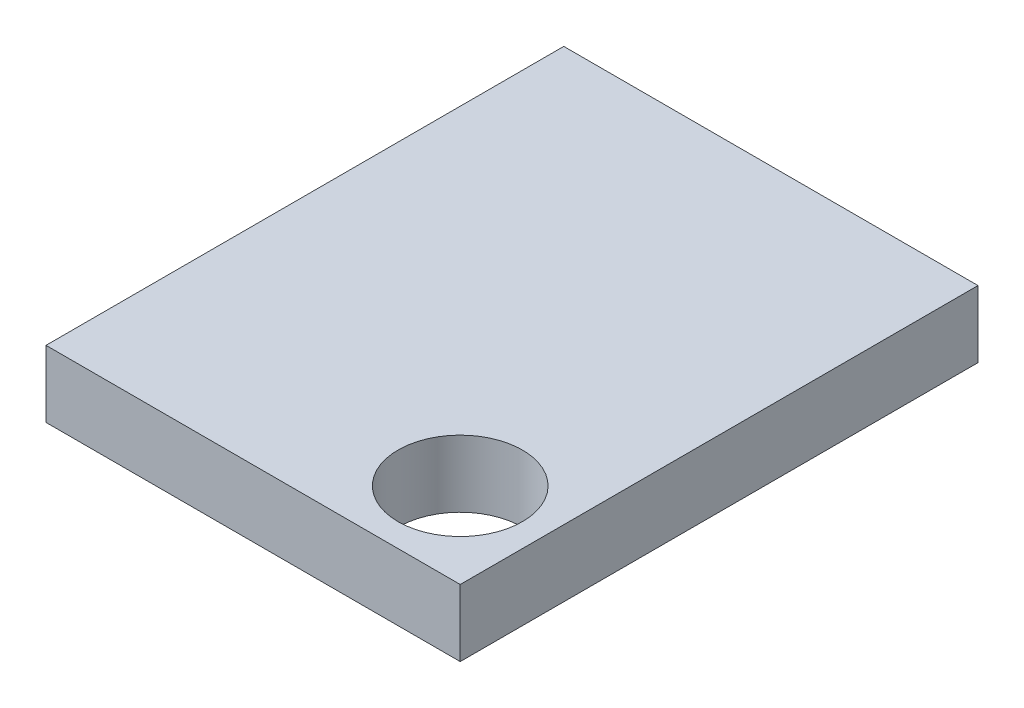
ISO-10303-21;
HEADER;
FILE_DESCRIPTION(('STEP AP214'),'2;1');
FILE_NAME('part.step','',(''),(''),'','','');
FILE_SCHEMA(('AUTOMOTIVE_DESIGN { 1 0 10303 214 1 1 1 1 }'));
ENDSEC;
DATA;
#1=APPLICATION_CONTEXT('core data for automotive mechanical design processes');
#2=APPLICATION_PROTOCOL_DEFINITION('international standard','automotive_design',2000,#1);
#3=PRODUCT_CONTEXT('',#1,'mechanical');
#4=PRODUCT('Part','Part','',(#3));
#5=PRODUCT_RELATED_PRODUCT_CATEGORY('part','',(#4));
#6=PRODUCT_DEFINITION_FORMATION('','',#4);
#7=PRODUCT_DEFINITION_CONTEXT('part definition',#1,'design');
#8=PRODUCT_DEFINITION('design','',#6,#7);
#9=PRODUCT_DEFINITION_SHAPE('','',#8);
#10=(LENGTH_UNIT() NAMED_UNIT(*) SI_UNIT(.MILLI.,.METRE.));
#11=(NAMED_UNIT(*) PLANE_ANGLE_UNIT() SI_UNIT($,.RADIAN.));
#12=(NAMED_UNIT(*) SI_UNIT($,.STERADIAN.) SOLID_ANGLE_UNIT());
#13=UNCERTAINTY_MEASURE_WITH_UNIT(LENGTH_MEASURE(1.E-05),#10,'distance_accuracy_value','');
#14=(GEOMETRIC_REPRESENTATION_CONTEXT(3) GLOBAL_UNCERTAINTY_ASSIGNED_CONTEXT((#13)) GLOBAL_UNIT_ASSIGNED_CONTEXT((#10,
#11,#12)) REPRESENTATION_CONTEXT('',''));
#15=CARTESIAN_POINT('',(0.,0.,0.));
#16=DIRECTION('',(0.,0.,1.));
#17=DIRECTION('',(1.,0.,0.));
#18=AXIS2_PLACEMENT_3D('',#15,#16,#17);
#19=CARTESIAN_POINT('',(5.08,1.6383,6.35));
#20=DIRECTION('',(-1.,0.,0.));
#21=DIRECTION('',(0.,0.,1.));
#22=AXIS2_PLACEMENT_3D('',#19,#20,#21);
#23=PLANE('',#22);
#24=DIRECTION('',(0.,0.,-1.));
#25=VECTOR('',#24,1.);
#26=CARTESIAN_POINT('',(5.08,0.,6.35));
#27=LINE('',#26,#25);
#28=CARTESIAN_POINT('',(5.08,0.,6.35));
#29=VERTEX_POINT('',#28);
#30=CARTESIAN_POINT('',(5.08,0.,-6.35));
#31=VERTEX_POINT('',#30);
#32=EDGE_CURVE('E98',#29,#31,#27,.T.);
#33=ORIENTED_EDGE('',*,*,#32,.T.);
#34=DIRECTION('',(0.,-1.,0.));
#35=VECTOR('',#34,1.);
#36=CARTESIAN_POINT('',(5.08,1.6383,-6.35));
#37=LINE('',#36,#35);
#38=CARTESIAN_POINT('',(5.08,1.6383,-6.35));
#39=VERTEX_POINT('',#38);
#40=EDGE_CURVE('E11',#39,#31,#37,.T.);
#41=ORIENTED_EDGE('',*,*,#40,.F.);
#42=DIRECTION('',(0.,0.,-1.));
#43=VECTOR('',#42,1.);
#44=CARTESIAN_POINT('',(5.08,1.6383,6.35));
#45=LINE('',#44,#43);
#46=CARTESIAN_POINT('',(5.08,1.6383,6.35));
#47=VERTEX_POINT('',#46);
#48=EDGE_CURVE('E86',#47,#39,#45,.T.);
#49=ORIENTED_EDGE('',*,*,#48,.F.);
#50=DIRECTION('',(0.,-1.,0.));
#51=VECTOR('',#50,1.);
#52=CARTESIAN_POINT('',(5.08,1.6383,6.35));
#53=LINE('',#52,#51);
#54=EDGE_CURVE('E94',#47,#29,#53,.T.);
#55=ORIENTED_EDGE('',*,*,#54,.T.);
#56=EDGE_LOOP('',(#33,#41,#49,#55));
#57=FACE_BOUND('',#56,.T.);
#58=ADVANCED_FACE('F35',(#57),#23,.F.);
#59=CARTESIAN_POINT('',(-5.08,1.6383,-6.35));
#60=DIRECTION('',(0.,0.,1.));
#61=DIRECTION('',(1.,0.,0.));
#62=AXIS2_PLACEMENT_3D('',#59,#60,#61);
#63=PLANE('',#62);
#64=DIRECTION('',(-1.,0.,0.));
#65=VECTOR('',#64,1.);
#66=CARTESIAN_POINT('',(-5.08,0.,-6.35));
#67=LINE('',#66,#65);
#68=CARTESIAN_POINT('',(-5.08,0.,-6.35));
#69=VERTEX_POINT('',#68);
#70=EDGE_CURVE('E90',#31,#69,#67,.T.);
#71=ORIENTED_EDGE('',*,*,#70,.T.);
#72=DIRECTION('',(0.,-1.,0.));
#73=VECTOR('',#72,1.);
#74=CARTESIAN_POINT('',(-5.08,1.6383,-6.35));
#75=LINE('',#74,#73);
#76=CARTESIAN_POINT('',(-5.08,1.6383,-6.35));
#77=VERTEX_POINT('',#76);
#78=EDGE_CURVE('E43',#77,#69,#75,.T.);
#79=ORIENTED_EDGE('',*,*,#78,.F.);
#80=DIRECTION('',(-1.,0.,0.));
#81=VECTOR('',#80,1.);
#82=CARTESIAN_POINT('',(-5.08,1.6383,-6.35));
#83=LINE('',#82,#81);
#84=EDGE_CURVE('E81',#39,#77,#83,.T.);
#85=ORIENTED_EDGE('',*,*,#84,.F.);
#86=ORIENTED_EDGE('',*,*,#40,.T.);
#87=EDGE_LOOP('',(#71,#79,#85,#86));
#88=FACE_BOUND('',#87,.T.);
#89=ADVANCED_FACE('F89',(#88),#63,.F.);
#90=CARTESIAN_POINT('',(-5.08,1.6383,6.35));
#91=DIRECTION('',(1.,0.,0.));
#92=DIRECTION('',(0.,0.,-1.));
#93=AXIS2_PLACEMENT_3D('',#90,#91,#92);
#94=PLANE('',#93);
#95=DIRECTION('',(0.,0.,1.));
#96=VECTOR('',#95,1.);
#97=CARTESIAN_POINT('',(-5.08,0.,6.35));
#98=LINE('',#97,#96);
#99=CARTESIAN_POINT('',(-5.08,0.,6.35));
#100=VERTEX_POINT('',#99);
#101=EDGE_CURVE('E68',#69,#100,#98,.T.);
#102=ORIENTED_EDGE('',*,*,#101,.T.);
#103=DIRECTION('',(0.,-1.,0.));
#104=VECTOR('',#103,1.);
#105=CARTESIAN_POINT('',(-5.08,1.6383,6.35));
#106=LINE('',#105,#104);
#107=CARTESIAN_POINT('',(-5.08,1.6383,6.35));
#108=VERTEX_POINT('',#107);
#109=EDGE_CURVE('E91',#108,#100,#106,.T.);
#110=ORIENTED_EDGE('',*,*,#109,.F.);
#111=DIRECTION('',(0.,0.,1.));
#112=VECTOR('',#111,1.);
#113=CARTESIAN_POINT('',(-5.08,1.6383,6.35));
#114=LINE('',#113,#112);
#115=EDGE_CURVE('E84',#77,#108,#114,.T.);
#116=ORIENTED_EDGE('',*,*,#115,.F.);
#117=ORIENTED_EDGE('',*,*,#78,.T.);
#118=EDGE_LOOP('',(#102,#110,#116,#117));
#119=FACE_BOUND('',#118,.T.);
#120=ADVANCED_FACE('F92',(#119),#94,.F.);
#121=CARTESIAN_POINT('',(-5.08,1.6383,6.35));
#122=DIRECTION('',(0.,0.,-1.));
#123=DIRECTION('',(-1.,0.,0.));
#124=AXIS2_PLACEMENT_3D('',#121,#122,#123);
#125=PLANE('',#124);
#126=DIRECTION('',(1.,0.,0.));
#127=VECTOR('',#126,1.);
#128=CARTESIAN_POINT('',(-5.08,0.,6.35));
#129=LINE('',#128,#127);
#130=EDGE_CURVE('E74',#100,#29,#129,.T.);
#131=ORIENTED_EDGE('',*,*,#130,.T.);
#132=ORIENTED_EDGE('',*,*,#54,.F.);
#133=DIRECTION('',(1.,0.,0.));
#134=VECTOR('',#133,1.);
#135=CARTESIAN_POINT('',(-5.08,1.6383,6.35));
#136=LINE('',#135,#134);
#137=EDGE_CURVE('E51',#108,#47,#136,.T.);
#138=ORIENTED_EDGE('',*,*,#137,.F.);
#139=ORIENTED_EDGE('',*,*,#109,.T.);
#140=EDGE_LOOP('',(#131,#132,#138,#139));
#141=FACE_BOUND('',#140,.T.);
#142=ADVANCED_FACE('F106',(#141),#125,.F.);
#143=CARTESIAN_POINT('',(0.,1.6383,0.));
#144=DIRECTION('',(0.,-1.,0.));
#145=DIRECTION('',(0.,0.,-1.));
#146=AXIS2_PLACEMENT_3D('',#143,#144,#145);
#147=PLANE('',#146);
#148=CARTESIAN_POINT('',(2.9845,1.6383,4.2545));
#149=DIRECTION('',(0.,1.,0.));
#150=DIRECTION('',(0.,0.,1.));
#151=AXIS2_PLACEMENT_3D('',#148,#149,#150);
#152=CIRCLE('',#151,1.524);
#153=CARTESIAN_POINT('',(2.9845,1.6383,5.7785));
#154=VERTEX_POINT('',#153);
#155=EDGE_CURVE('E112',#154,#154,#152,.T.);
#156=ORIENTED_EDGE('',*,*,#155,.F.);
#157=EDGE_LOOP('',(#156));
#158=FACE_BOUND('',#157,.T.);
#159=ORIENTED_EDGE('',*,*,#48,.T.);
#160=ORIENTED_EDGE('',*,*,#84,.T.);
#161=ORIENTED_EDGE('',*,*,#115,.T.);
#162=ORIENTED_EDGE('',*,*,#137,.T.);
#163=EDGE_LOOP('',(#159,#160,#161,#162));
#164=FACE_BOUND('',#163,.T.);
#165=ADVANCED_FACE('F82',(#158,#164),#147,.F.);
#166=CARTESIAN_POINT('',(0.,0.,0.));
#167=DIRECTION('',(0.,-1.,0.));
#168=DIRECTION('',(0.,0.,-1.));
#169=AXIS2_PLACEMENT_3D('',#166,#167,#168);
#170=PLANE('',#169);
#171=CARTESIAN_POINT('',(2.9845,0.,4.2545));
#172=DIRECTION('',(0.,1.,0.));
#173=DIRECTION('',(0.,0.,1.));
#174=AXIS2_PLACEMENT_3D('',#171,#172,#173);
#175=CIRCLE('',#174,1.524);
#176=CARTESIAN_POINT('',(2.9845,0.,5.7785));
#177=VERTEX_POINT('',#176);
#178=EDGE_CURVE('E101',#177,#177,#175,.T.);
#179=ORIENTED_EDGE('',*,*,#178,.T.);
#180=EDGE_LOOP('',(#179));
#181=FACE_BOUND('',#180,.T.);
#182=ORIENTED_EDGE('',*,*,#32,.F.);
#183=ORIENTED_EDGE('',*,*,#130,.F.);
#184=ORIENTED_EDGE('',*,*,#101,.F.);
#185=ORIENTED_EDGE('',*,*,#70,.F.);
#186=EDGE_LOOP('',(#182,#183,#184,#185));
#187=FACE_BOUND('',#186,.T.);
#188=ADVANCED_FACE('F109',(#181,#187),#170,.T.);
#189=CARTESIAN_POINT('',(2.9845,0.,4.2545));
#190=DIRECTION('',(0.,1.,0.));
#191=DIRECTION('',(0.,0.,1.));
#192=AXIS2_PLACEMENT_3D('',#189,#190,#191);
#193=CYLINDRICAL_SURFACE('',#192,1.524);
#194=CARTESIAN_POINT('',(2.9845,0.,5.7785));
#195=CARTESIAN_POINT('',(2.9845,0.017065625,5.7785));
#196=CARTESIAN_POINT('',(2.9845,0.03413125,5.7785));
#197=CARTESIAN_POINT('',(2.9845,0.0682625,5.7785));
#198=CARTESIAN_POINT('',(2.9845,0.085328125,5.7785));
#199=CARTESIAN_POINT('',(2.9845,0.119459375,5.7785));
#200=CARTESIAN_POINT('',(2.9845,0.136525,5.7785));
#201=CARTESIAN_POINT('',(2.9845,0.17065625,5.7785));
#202=CARTESIAN_POINT('',(2.9845,0.187721875,5.7785));
#203=CARTESIAN_POINT('',(2.9845,0.221853125,5.7785));
#204=CARTESIAN_POINT('',(2.9845,0.23891875,5.7785));
#205=CARTESIAN_POINT('',(2.9845,0.27305,5.7785));
#206=CARTESIAN_POINT('',(2.9845,0.290115625,5.7785));
#207=CARTESIAN_POINT('',(2.9845,0.324246875,5.7785));
#208=CARTESIAN_POINT('',(2.9845,0.3413125,5.7785));
#209=CARTESIAN_POINT('',(2.9845,0.37544375,5.7785));
#210=CARTESIAN_POINT('',(2.9845,0.392509375,5.7785));
#211=CARTESIAN_POINT('',(2.9845,0.426640625,5.7785));
#212=CARTESIAN_POINT('',(2.9845,0.44370625,5.7785));
#213=CARTESIAN_POINT('',(2.9845,0.4778375,5.7785));
#214=CARTESIAN_POINT('',(2.9845,0.494903125,5.7785));
#215=CARTESIAN_POINT('',(2.9845,0.529034375,5.7785));
#216=CARTESIAN_POINT('',(2.9845,0.5461,5.7785));
#217=CARTESIAN_POINT('',(2.9845,0.58023125,5.7785));
#218=CARTESIAN_POINT('',(2.9845,0.597296875,5.7785));
#219=CARTESIAN_POINT('',(2.9845,0.631428125,5.7785));
#220=CARTESIAN_POINT('',(2.9845,0.64849375,5.7785));
#221=CARTESIAN_POINT('',(2.9845,0.682625,5.7785));
#222=CARTESIAN_POINT('',(2.9845,0.699690625,5.7785));
#223=CARTESIAN_POINT('',(2.9845,0.733821875,5.7785));
#224=CARTESIAN_POINT('',(2.9845,0.7508875,5.7785));
#225=CARTESIAN_POINT('',(2.9845,0.78501875,5.7785));
#226=CARTESIAN_POINT('',(2.9845,0.802084375,5.7785));
#227=CARTESIAN_POINT('',(2.9845,0.836215625,5.7785));
#228=CARTESIAN_POINT('',(2.9845,0.85328125,5.7785));
#229=CARTESIAN_POINT('',(2.9845,0.8874125,5.7785));
#230=CARTESIAN_POINT('',(2.9845,0.904478125,5.7785));
#231=CARTESIAN_POINT('',(2.9845,0.938609375,5.7785));
#232=CARTESIAN_POINT('',(2.9845,0.955675,5.7785));
#233=CARTESIAN_POINT('',(2.9845,0.98980625,5.7785));
#234=CARTESIAN_POINT('',(2.9845,1.006871875,5.7785));
#235=CARTESIAN_POINT('',(2.9845,1.041003125,5.7785));
#236=CARTESIAN_POINT('',(2.9845,1.05806875,5.7785));
#237=CARTESIAN_POINT('',(2.9845,1.0922,5.7785));
#238=CARTESIAN_POINT('',(2.9845,1.109265625,5.7785));
#239=CARTESIAN_POINT('',(2.9845,1.143396875,5.7785));
#240=CARTESIAN_POINT('',(2.9845,1.1604625,5.7785));
#241=CARTESIAN_POINT('',(2.9845,1.19459375,5.7785));
#242=CARTESIAN_POINT('',(2.9845,1.211659375,5.7785));
#243=CARTESIAN_POINT('',(2.9845,1.245790625,5.7785));
#244=CARTESIAN_POINT('',(2.9845,1.26285625,5.7785));
#245=CARTESIAN_POINT('',(2.9845,1.2969875,5.7785));
#246=CARTESIAN_POINT('',(2.9845,1.314053125,5.7785));
#247=CARTESIAN_POINT('',(2.9845,1.348184375,5.7785));
#248=CARTESIAN_POINT('',(2.9845,1.36525,5.7785));
#249=CARTESIAN_POINT('',(2.9845,1.39938125,5.7785));
#250=CARTESIAN_POINT('',(2.9845,1.416446875,5.7785));
#251=CARTESIAN_POINT('',(2.9845,1.450578125,5.7785));
#252=CARTESIAN_POINT('',(2.9845,1.46764375,5.7785));
#253=CARTESIAN_POINT('',(2.9845,1.501775,5.7785));
#254=CARTESIAN_POINT('',(2.9845,1.518840625,5.7785));
#255=CARTESIAN_POINT('',(2.9845,1.552971875,5.7785));
#256=CARTESIAN_POINT('',(2.9845,1.5700375,5.7785));
#257=CARTESIAN_POINT('',(2.9845,1.60416875,5.7785));
#258=CARTESIAN_POINT('',(2.9845,1.621234375,5.7785));
#259=CARTESIAN_POINT('',(2.9845,1.6383,5.7785));
#260=B_SPLINE_CURVE_WITH_KNOTS('',3,(#194,#195,#196,#197,#198,#199,#200,#201,#202,#203,#204,
#205,#206,#207,#208,#209,#210,#211,#212,#213,#214,#215,#216,#217,#218,#219,#220,#221,#222,#223,
#224,#225,#226,#227,#228,#229,#230,#231,#232,#233,#234,#235,#236,#237,#238,#239,#240,#241,#242,
#243,#244,#245,#246,#247,#248,#249,#250,#251,#252,#253,#254,#255,#256,#257,#258,#259),
.UNSPECIFIED.,.F.,.F.,(4,2,2,2,2,2,2,2,2,2,2,2,2,2,2,2,2,2,2,2,2,2,2,2,2,2,2,2,2,2,2,2,4),(0.,
0.051196875,0.10239375,0.153590625,0.2047875,0.255984375,0.30718125,0.358378125,0.409575,
0.460771875,0.51196875,0.563165625,0.6143625,0.665559375,0.71675625,0.767953125,0.81915,
0.870346875,0.92154375,0.972740625,1.0239375,1.075134375,1.12633125,1.177528125,1.228725,
1.279921875,1.33111875,1.382315625,1.4335125,1.484709375,1.53590625,1.587103125,1.6383),.UNSPECIFIED.);
#261=EDGE_CURVE('BSEAM119',#177,#154,#260,.T.);
#262=ORIENTED_EDGE('',*,*,#178,.F.);
#263=ORIENTED_EDGE('',*,*,#155,.T.);
#264=ORIENTED_EDGE('',*,*,#261,.T.);
#265=ORIENTED_EDGE('',*,*,#261,.F.);
#266=EDGE_LOOP('',(#262,#264,#263,#265));
#267=FACE_BOUND('',#266,.T.);
#268=ADVANCED_FACE('F119',(#267),#193,.F.);
#269=CLOSED_SHELL('',(#58,#89,#120,#142,#165,#188,#268));
#270=MANIFOLD_SOLID_BREP('B2',#269);
#271=ADVANCED_BREP_SHAPE_REPRESENTATION('',(#18,#270),#14);
#272=SHAPE_DEFINITION_REPRESENTATION(#9,#271);
ENDSEC;
END-ISO-10303-21;
